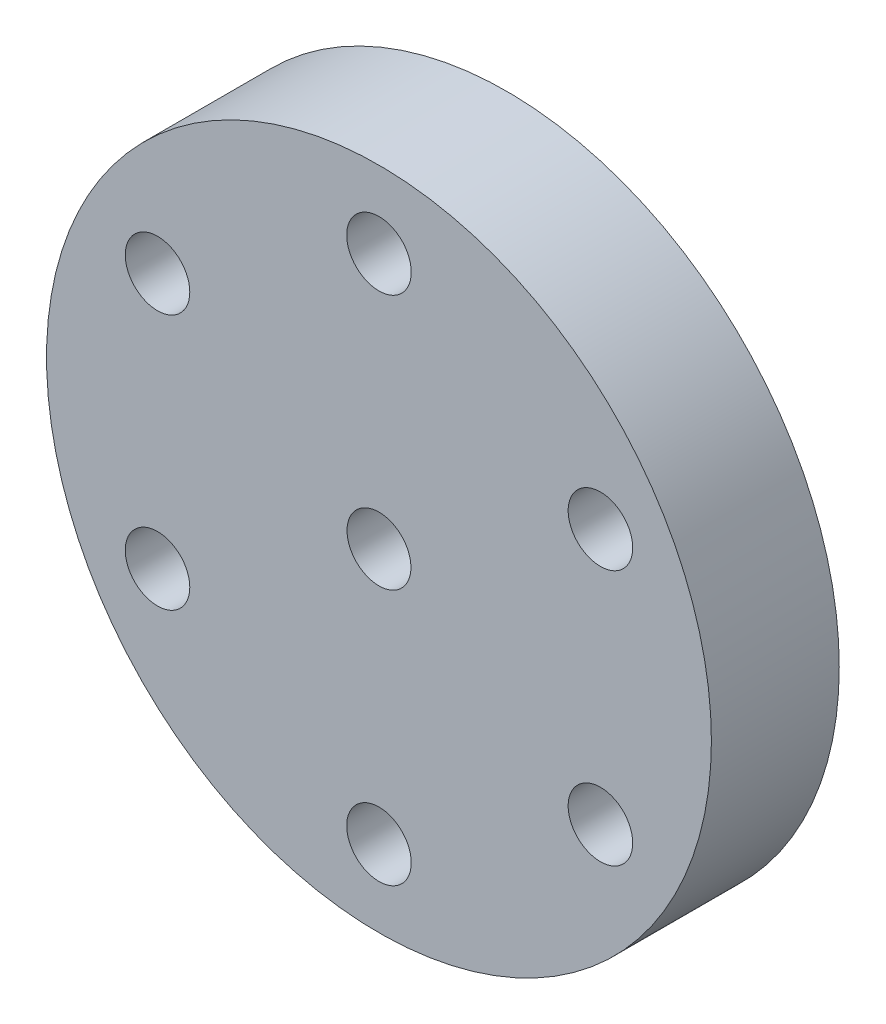
ISO-10303-21;
HEADER;
FILE_DESCRIPTION(('STEP AP214'),'2;1');
FILE_NAME('part.step','',(''),(''),'','','');
FILE_SCHEMA(('AUTOMOTIVE_DESIGN { 1 0 10303 214 1 1 1 1 }'));
ENDSEC;
DATA;
#1=APPLICATION_CONTEXT('core data for automotive mechanical design processes');
#2=APPLICATION_PROTOCOL_DEFINITION('international standard','automotive_design',2000,#1);
#3=PRODUCT_CONTEXT('',#1,'mechanical');
#4=PRODUCT('Part','Part','',(#3));
#5=PRODUCT_RELATED_PRODUCT_CATEGORY('part','',(#4));
#6=PRODUCT_DEFINITION_FORMATION('','',#4);
#7=PRODUCT_DEFINITION_CONTEXT('part definition',#1,'design');
#8=PRODUCT_DEFINITION('design','',#6,#7);
#9=PRODUCT_DEFINITION_SHAPE('','',#8);
#10=(LENGTH_UNIT() NAMED_UNIT(*) SI_UNIT(.MILLI.,.METRE.));
#11=(NAMED_UNIT(*) PLANE_ANGLE_UNIT() SI_UNIT($,.RADIAN.));
#12=(NAMED_UNIT(*) SI_UNIT($,.STERADIAN.) SOLID_ANGLE_UNIT());
#13=UNCERTAINTY_MEASURE_WITH_UNIT(LENGTH_MEASURE(1.E-05),#10,'distance_accuracy_value','');
#14=(GEOMETRIC_REPRESENTATION_CONTEXT(3) GLOBAL_UNCERTAINTY_ASSIGNED_CONTEXT((#13)) GLOBAL_UNIT_ASSIGNED_CONTEXT((#10,
#11,#12)) REPRESENTATION_CONTEXT('',''));
#15=CARTESIAN_POINT('',(0.,0.,0.));
#16=DIRECTION('',(0.,0.,1.));
#17=DIRECTION('',(1.,0.,0.));
#18=AXIS2_PLACEMENT_3D('',#15,#16,#17);
#19=CARTESIAN_POINT('',(0.,0.,10.));
#20=DIRECTION('',(0.,0.,1.));
#21=DIRECTION('',(1.,0.,0.));
#22=AXIS2_PLACEMENT_3D('',#19,#20,#21);
#23=PLANE('',#22);
#24=CARTESIAN_POINT('',(1.13196979001957E-12,-20.,10.));
#25=DIRECTION('',(0.,0.,1.));
#26=DIRECTION('',(1.,0.,0.));
#27=AXIS2_PLACEMENT_3D('',#24,#25,#26);
#28=CIRCLE('',#27,2.52359364911838);
#29=CARTESIAN_POINT('',(2.52359364911951,-20.,10.));
#30=VERTEX_POINT('',#29);
#31=EDGE_CURVE('E71',#30,#30,#28,.T.);
#32=ORIENTED_EDGE('',*,*,#31,.F.);
#33=EDGE_LOOP('',(#32));
#34=FACE_BOUND('',#33,.T.);
#35=CARTESIAN_POINT('',(17.3205080756891,10.0000000000005,10.));
#36=DIRECTION('',(0.,0.,1.));
#37=DIRECTION('',(1.,0.,0.));
#38=AXIS2_PLACEMENT_3D('',#35,#36,#37);
#39=CIRCLE('',#38,2.52359364911724);
#40=CARTESIAN_POINT('',(19.8441017248064,10.0000000000005,10.));
#41=VERTEX_POINT('',#40);
#42=EDGE_CURVE('E59',#41,#41,#39,.T.);
#43=ORIENTED_EDGE('',*,*,#42,.F.);
#44=EDGE_LOOP('',(#43));
#45=FACE_BOUND('',#44,.T.);
#46=CARTESIAN_POINT('',(0.,20.,10.));
#47=DIRECTION('',(0.,0.,1.));
#48=DIRECTION('',(1.,0.,0.));
#49=AXIS2_PLACEMENT_3D('',#46,#47,#48);
#50=CIRCLE('',#49,2.52359364911627);
#51=CARTESIAN_POINT('',(2.52359364911627,20.,10.));
#52=VERTEX_POINT('',#51);
#53=EDGE_CURVE('E47',#52,#52,#50,.T.);
#54=ORIENTED_EDGE('',*,*,#53,.F.);
#55=EDGE_LOOP('',(#54));
#56=FACE_BOUND('',#55,.T.);
#57=CARTESIAN_POINT('',(0.,0.,10.));
#58=DIRECTION('',(0.,0.,1.));
#59=DIRECTION('',(1.,0.,0.));
#60=AXIS2_PLACEMENT_3D('',#57,#58,#59);
#61=CIRCLE('',#60,26.);
#62=CARTESIAN_POINT('',(26.,0.,10.));
#63=VERTEX_POINT('',#62);
#64=EDGE_CURVE('E10',#63,#63,#61,.T.);
#65=ORIENTED_EDGE('',*,*,#64,.T.);
#66=EDGE_LOOP('',(#65));
#67=FACE_BOUND('',#66,.T.);
#68=CARTESIAN_POINT('',(0.,0.,10.));
#69=DIRECTION('',(0.,0.,1.));
#70=DIRECTION('',(1.,0.,0.));
#71=AXIS2_PLACEMENT_3D('',#68,#69,#70);
#72=CIRCLE('',#71,2.5);
#73=CARTESIAN_POINT('',(2.5,0.,10.));
#74=VERTEX_POINT('',#73);
#75=EDGE_CURVE('E42',#74,#74,#72,.T.);
#76=ORIENTED_EDGE('',*,*,#75,.F.);
#77=EDGE_LOOP('',(#76));
#78=FACE_BOUND('',#77,.T.);
#79=CARTESIAN_POINT('',(-17.3205080756879,-10.0000000000005,10.));
#80=DIRECTION('',(0.,0.,1.));
#81=DIRECTION('',(1.,0.,0.));
#82=AXIS2_PLACEMENT_3D('',#79,#80,#81);
#83=CIRCLE('',#82,2.52359364911741);
#84=CARTESIAN_POINT('',(-14.7969144265705,-10.0000000000005,10.));
#85=VERTEX_POINT('',#84);
#86=EDGE_CURVE('E53',#85,#85,#83,.T.);
#87=ORIENTED_EDGE('',*,*,#86,.F.);
#88=EDGE_LOOP('',(#87));
#89=FACE_BOUND('',#88,.T.);
#90=CARTESIAN_POINT('',(17.3205080756892,-9.99999999999934,10.));
#91=DIRECTION('',(0.,0.,1.));
#92=DIRECTION('',(1.,0.,0.));
#93=AXIS2_PLACEMENT_3D('',#90,#91,#92);
#94=CIRCLE('',#93,2.52359364911791);
#95=CARTESIAN_POINT('',(19.8441017248071,-9.99999999999934,10.));
#96=VERTEX_POINT('',#95);
#97=EDGE_CURVE('E65',#96,#96,#94,.T.);
#98=ORIENTED_EDGE('',*,*,#97,.F.);
#99=EDGE_LOOP('',(#98));
#100=FACE_BOUND('',#99,.T.);
#101=CARTESIAN_POINT('',(-17.3205080756885,9.9999999999995,10.));
#102=DIRECTION('',(0.,0.,1.));
#103=DIRECTION('',(1.,0.,0.));
#104=AXIS2_PLACEMENT_3D('',#101,#102,#103);
#105=CIRCLE('',#104,2.52359364911692);
#106=CARTESIAN_POINT('',(-14.7969144265716,9.9999999999995,10.));
#107=VERTEX_POINT('',#106);
#108=EDGE_CURVE('E77',#107,#107,#105,.T.);
#109=ORIENTED_EDGE('',*,*,#108,.F.);
#110=EDGE_LOOP('',(#109));
#111=FACE_BOUND('',#110,.T.);
#112=ADVANCED_FACE('F31',(#34,#45,#56,#67,#78,#89,#100,#111),#23,.T.);
#113=CARTESIAN_POINT('',(0.,0.,0.));
#114=DIRECTION('',(0.,0.,1.));
#115=DIRECTION('',(1.,0.,0.));
#116=AXIS2_PLACEMENT_3D('',#113,#114,#115);
#117=PLANE('',#116);
#118=CARTESIAN_POINT('',(0.,0.,0.));
#119=DIRECTION('',(0.,0.,1.));
#120=DIRECTION('',(1.,0.,0.));
#121=AXIS2_PLACEMENT_3D('',#118,#119,#120);
#122=CIRCLE('',#121,26.);
#123=CARTESIAN_POINT('',(26.,0.,0.));
#124=VERTEX_POINT('',#123);
#125=EDGE_CURVE('E35',#124,#124,#122,.T.);
#126=ORIENTED_EDGE('',*,*,#125,.F.);
#127=EDGE_LOOP('',(#126));
#128=FACE_BOUND('',#127,.T.);
#129=CARTESIAN_POINT('',(0.,0.,0.));
#130=DIRECTION('',(0.,0.,1.));
#131=DIRECTION('',(1.,0.,0.));
#132=AXIS2_PLACEMENT_3D('',#129,#130,#131);
#133=CIRCLE('',#132,2.5);
#134=CARTESIAN_POINT('',(2.5,0.,0.));
#135=VERTEX_POINT('',#134);
#136=EDGE_CURVE('E44',#135,#135,#133,.T.);
#137=ORIENTED_EDGE('',*,*,#136,.T.);
#138=EDGE_LOOP('',(#137));
#139=FACE_BOUND('',#138,.T.);
#140=CARTESIAN_POINT('',(0.,20.,0.));
#141=DIRECTION('',(0.,0.,1.));
#142=DIRECTION('',(1.,0.,0.));
#143=AXIS2_PLACEMENT_3D('',#140,#141,#142);
#144=CIRCLE('',#143,2.52359364911627);
#145=CARTESIAN_POINT('',(2.52359364911627,20.,0.));
#146=VERTEX_POINT('',#145);
#147=EDGE_CURVE('E50',#146,#146,#144,.T.);
#148=ORIENTED_EDGE('',*,*,#147,.T.);
#149=EDGE_LOOP('',(#148));
#150=FACE_BOUND('',#149,.T.);
#151=CARTESIAN_POINT('',(-17.3205080756879,-10.0000000000005,0.));
#152=DIRECTION('',(0.,0.,1.));
#153=DIRECTION('',(1.,0.,0.));
#154=AXIS2_PLACEMENT_3D('',#151,#152,#153);
#155=CIRCLE('',#154,2.52359364911741);
#156=CARTESIAN_POINT('',(-14.7969144265705,-10.0000000000005,0.));
#157=VERTEX_POINT('',#156);
#158=EDGE_CURVE('E56',#157,#157,#155,.T.);
#159=ORIENTED_EDGE('',*,*,#158,.T.);
#160=EDGE_LOOP('',(#159));
#161=FACE_BOUND('',#160,.T.);
#162=CARTESIAN_POINT('',(17.3205080756891,10.0000000000005,0.));
#163=DIRECTION('',(0.,0.,1.));
#164=DIRECTION('',(1.,0.,0.));
#165=AXIS2_PLACEMENT_3D('',#162,#163,#164);
#166=CIRCLE('',#165,2.52359364911724);
#167=CARTESIAN_POINT('',(19.8441017248064,10.0000000000005,0.));
#168=VERTEX_POINT('',#167);
#169=EDGE_CURVE('E62',#168,#168,#166,.T.);
#170=ORIENTED_EDGE('',*,*,#169,.T.);
#171=EDGE_LOOP('',(#170));
#172=FACE_BOUND('',#171,.T.);
#173=CARTESIAN_POINT('',(17.3205080756892,-9.99999999999934,0.));
#174=DIRECTION('',(0.,0.,1.));
#175=DIRECTION('',(1.,0.,0.));
#176=AXIS2_PLACEMENT_3D('',#173,#174,#175);
#177=CIRCLE('',#176,2.52359364911791);
#178=CARTESIAN_POINT('',(19.8441017248071,-9.99999999999934,0.));
#179=VERTEX_POINT('',#178);
#180=EDGE_CURVE('E68',#179,#179,#177,.T.);
#181=ORIENTED_EDGE('',*,*,#180,.T.);
#182=EDGE_LOOP('',(#181));
#183=FACE_BOUND('',#182,.T.);
#184=CARTESIAN_POINT('',(1.13196979001957E-12,-20.,0.));
#185=DIRECTION('',(0.,0.,1.));
#186=DIRECTION('',(1.,0.,0.));
#187=AXIS2_PLACEMENT_3D('',#184,#185,#186);
#188=CIRCLE('',#187,2.52359364911838);
#189=CARTESIAN_POINT('',(2.52359364911951,-20.,0.));
#190=VERTEX_POINT('',#189);
#191=EDGE_CURVE('E74',#190,#190,#188,.T.);
#192=ORIENTED_EDGE('',*,*,#191,.T.);
#193=EDGE_LOOP('',(#192));
#194=FACE_BOUND('',#193,.T.);
#195=CARTESIAN_POINT('',(-17.3205080756885,9.9999999999995,0.));
#196=DIRECTION('',(0.,0.,1.));
#197=DIRECTION('',(1.,0.,0.));
#198=AXIS2_PLACEMENT_3D('',#195,#196,#197);
#199=CIRCLE('',#198,2.52359364911692);
#200=CARTESIAN_POINT('',(-14.7969144265716,9.9999999999995,0.));
#201=VERTEX_POINT('',#200);
#202=EDGE_CURVE('E80',#201,#201,#199,.T.);
#203=ORIENTED_EDGE('',*,*,#202,.T.);
#204=EDGE_LOOP('',(#203));
#205=FACE_BOUND('',#204,.T.);
#206=ADVANCED_FACE('F90',(#128,#139,#150,#161,#172,#183,#194,#205),#117,.F.);
#207=CARTESIAN_POINT('',(0.,0.,10.));
#208=DIRECTION('',(0.,0.,-1.));
#209=DIRECTION('',(-1.,0.,0.));
#210=AXIS2_PLACEMENT_3D('',#207,#208,#209);
#211=CYLINDRICAL_SURFACE('',#210,26.);
#212=ORIENTED_EDGE('',*,*,#64,.F.);
#213=EDGE_LOOP('',(#212));
#214=FACE_BOUND('',#213,.T.);
#215=ORIENTED_EDGE('',*,*,#125,.T.);
#216=EDGE_LOOP('',(#215));
#217=FACE_BOUND('',#216,.T.);
#218=ADVANCED_FACE('F33',(#214,#217),#211,.T.);
#219=CARTESIAN_POINT('',(0.,0.,10.));
#220=DIRECTION('',(0.,0.,-1.));
#221=DIRECTION('',(-1.,0.,0.));
#222=AXIS2_PLACEMENT_3D('',#219,#220,#221);
#223=CYLINDRICAL_SURFACE('',#222,2.5);
#224=ORIENTED_EDGE('',*,*,#75,.T.);
#225=EDGE_LOOP('',(#224));
#226=FACE_BOUND('',#225,.T.);
#227=ORIENTED_EDGE('',*,*,#136,.F.);
#228=EDGE_LOOP('',(#227));
#229=FACE_BOUND('',#228,.T.);
#230=ADVANCED_FACE('F100',(#226,#229),#223,.F.);
#231=CARTESIAN_POINT('',(0.,20.,10.));
#232=DIRECTION('',(0.,0.,-1.));
#233=DIRECTION('',(-1.,0.,0.));
#234=AXIS2_PLACEMENT_3D('',#231,#232,#233);
#235=CYLINDRICAL_SURFACE('',#234,2.52359364911627);
#236=ORIENTED_EDGE('',*,*,#53,.T.);
#237=EDGE_LOOP('',(#236));
#238=FACE_BOUND('',#237,.T.);
#239=ORIENTED_EDGE('',*,*,#147,.F.);
#240=EDGE_LOOP('',(#239));
#241=FACE_BOUND('',#240,.T.);
#242=ADVANCED_FACE('F103',(#238,#241),#235,.F.);
#243=CARTESIAN_POINT('',(-17.3205080756879,-10.0000000000005,10.));
#244=DIRECTION('',(0.,0.,-1.));
#245=DIRECTION('',(-1.,0.,0.));
#246=AXIS2_PLACEMENT_3D('',#243,#244,#245);
#247=CYLINDRICAL_SURFACE('',#246,2.52359364911741);
#248=ORIENTED_EDGE('',*,*,#86,.T.);
#249=EDGE_LOOP('',(#248));
#250=FACE_BOUND('',#249,.T.);
#251=ORIENTED_EDGE('',*,*,#158,.F.);
#252=EDGE_LOOP('',(#251));
#253=FACE_BOUND('',#252,.T.);
#254=ADVANCED_FACE('F107',(#250,#253),#247,.F.);
#255=CARTESIAN_POINT('',(17.3205080756891,10.0000000000005,10.));
#256=DIRECTION('',(0.,0.,-1.));
#257=DIRECTION('',(-1.,0.,0.));
#258=AXIS2_PLACEMENT_3D('',#255,#256,#257);
#259=CYLINDRICAL_SURFACE('',#258,2.52359364911724);
#260=ORIENTED_EDGE('',*,*,#42,.T.);
#261=EDGE_LOOP('',(#260));
#262=FACE_BOUND('',#261,.T.);
#263=ORIENTED_EDGE('',*,*,#169,.F.);
#264=EDGE_LOOP('',(#263));
#265=FACE_BOUND('',#264,.T.);
#266=ADVANCED_FACE('F111',(#262,#265),#259,.F.);
#267=CARTESIAN_POINT('',(17.3205080756892,-9.99999999999934,10.));
#268=DIRECTION('',(0.,0.,-1.));
#269=DIRECTION('',(-1.,0.,0.));
#270=AXIS2_PLACEMENT_3D('',#267,#268,#269);
#271=CYLINDRICAL_SURFACE('',#270,2.52359364911791);
#272=ORIENTED_EDGE('',*,*,#97,.T.);
#273=EDGE_LOOP('',(#272));
#274=FACE_BOUND('',#273,.T.);
#275=ORIENTED_EDGE('',*,*,#180,.F.);
#276=EDGE_LOOP('',(#275));
#277=FACE_BOUND('',#276,.T.);
#278=ADVANCED_FACE('F115',(#274,#277),#271,.F.);
#279=CARTESIAN_POINT('',(1.13196979001957E-12,-20.,10.));
#280=DIRECTION('',(0.,0.,-1.));
#281=DIRECTION('',(-1.,0.,0.));
#282=AXIS2_PLACEMENT_3D('',#279,#280,#281);
#283=CYLINDRICAL_SURFACE('',#282,2.52359364911838);
#284=ORIENTED_EDGE('',*,*,#31,.T.);
#285=EDGE_LOOP('',(#284));
#286=FACE_BOUND('',#285,.T.);
#287=ORIENTED_EDGE('',*,*,#191,.F.);
#288=EDGE_LOOP('',(#287));
#289=FACE_BOUND('',#288,.T.);
#290=ADVANCED_FACE('F119',(#286,#289),#283,.F.);
#291=CARTESIAN_POINT('',(-17.3205080756885,9.9999999999995,10.));
#292=DIRECTION('',(0.,0.,-1.));
#293=DIRECTION('',(-1.,0.,0.));
#294=AXIS2_PLACEMENT_3D('',#291,#292,#293);
#295=CYLINDRICAL_SURFACE('',#294,2.52359364911692);
#296=ORIENTED_EDGE('',*,*,#108,.T.);
#297=EDGE_LOOP('',(#296));
#298=FACE_BOUND('',#297,.T.);
#299=ORIENTED_EDGE('',*,*,#202,.F.);
#300=EDGE_LOOP('',(#299));
#301=FACE_BOUND('',#300,.T.);
#302=ADVANCED_FACE('F86',(#298,#301),#295,.F.);
#303=CLOSED_SHELL('',(#112,#206,#218,#230,#242,#254,#266,#278,#290,#302));
#304=MANIFOLD_SOLID_BREP('B2',#303);
#305=ADVANCED_BREP_SHAPE_REPRESENTATION('',(#18,#304),#14);
#306=SHAPE_DEFINITION_REPRESENTATION(#9,#305);
ENDSEC;
END-ISO-10303-21;
